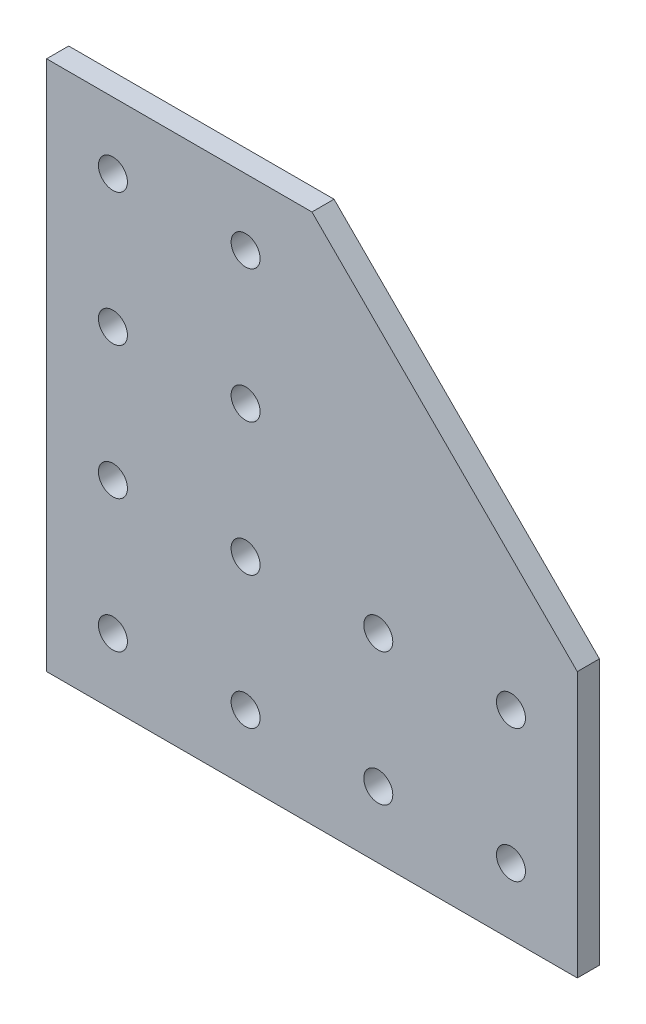
ISO-10303-21;
HEADER;
FILE_DESCRIPTION(('STEP AP214'),'2;1');
FILE_NAME('part.step','',(''),(''),'','','');
FILE_SCHEMA(('AUTOMOTIVE_DESIGN { 1 0 10303 214 1 1 1 1 }'));
ENDSEC;
DATA;
#1=APPLICATION_CONTEXT('core data for automotive mechanical design processes');
#2=APPLICATION_PROTOCOL_DEFINITION('international standard','automotive_design',2000,#1);
#3=PRODUCT_CONTEXT('',#1,'mechanical');
#4=PRODUCT('Part','Part','',(#3));
#5=PRODUCT_RELATED_PRODUCT_CATEGORY('part','',(#4));
#6=PRODUCT_DEFINITION_FORMATION('','',#4);
#7=PRODUCT_DEFINITION_CONTEXT('part definition',#1,'design');
#8=PRODUCT_DEFINITION('design','',#6,#7);
#9=PRODUCT_DEFINITION_SHAPE('','',#8);
#10=(LENGTH_UNIT() NAMED_UNIT(*) SI_UNIT(.MILLI.,.METRE.));
#11=(NAMED_UNIT(*) PLANE_ANGLE_UNIT() SI_UNIT($,.RADIAN.));
#12=(NAMED_UNIT(*) SI_UNIT($,.STERADIAN.) SOLID_ANGLE_UNIT());
#13=UNCERTAINTY_MEASURE_WITH_UNIT(LENGTH_MEASURE(1.E-05),#10,'distance_accuracy_value','');
#14=(GEOMETRIC_REPRESENTATION_CONTEXT(3) GLOBAL_UNCERTAINTY_ASSIGNED_CONTEXT((#13)) GLOBAL_UNIT_ASSIGNED_CONTEXT((#10,
#11,#12)) REPRESENTATION_CONTEXT('',''));
#15=CARTESIAN_POINT('',(0.,0.,0.));
#16=DIRECTION('',(0.,0.,1.));
#17=DIRECTION('',(1.,0.,0.));
#18=AXIS2_PLACEMENT_3D('',#15,#16,#17);
#19=CARTESIAN_POINT('',(0.,0.,3.175));
#20=DIRECTION('',(0.,0.,-1.));
#21=DIRECTION('',(-1.,0.,0.));
#22=AXIS2_PLACEMENT_3D('',#19,#20,#21);
#23=PLANE('',#22);
#24=CARTESIAN_POINT('',(57.15,133.35,3.175));
#25=DIRECTION('',(0.,0.,1.));
#26=DIRECTION('',(1.,0.,0.));
#27=AXIS2_PLACEMENT_3D('',#24,#25,#26);
#28=CIRCLE('',#27,4.1656);
#29=CARTESIAN_POINT('',(61.3156,133.35,3.175));
#30=VERTEX_POINT('',#29);
#31=EDGE_CURVE('E192',#30,#30,#28,.T.);
#32=ORIENTED_EDGE('',*,*,#31,.F.);
#33=EDGE_LOOP('',(#32));
#34=FACE_BOUND('',#33,.T.);
#35=CARTESIAN_POINT('',(57.15,57.15,3.175));
#36=DIRECTION('',(0.,0.,1.));
#37=DIRECTION('',(1.,0.,0.));
#38=AXIS2_PLACEMENT_3D('',#35,#36,#37);
#39=CIRCLE('',#38,4.1656);
#40=CARTESIAN_POINT('',(61.3156,57.15,3.175));
#41=VERTEX_POINT('',#40);
#42=EDGE_CURVE('E204',#41,#41,#39,.T.);
#43=ORIENTED_EDGE('',*,*,#42,.F.);
#44=EDGE_LOOP('',(#43));
#45=FACE_BOUND('',#44,.T.);
#46=CARTESIAN_POINT('',(133.35,57.15,3.175));
#47=DIRECTION('',(0.,0.,1.));
#48=DIRECTION('',(1.,0.,0.));
#49=AXIS2_PLACEMENT_3D('',#46,#47,#48);
#50=CIRCLE('',#49,4.1656);
#51=CARTESIAN_POINT('',(137.5156,57.15,3.175));
#52=VERTEX_POINT('',#51);
#53=EDGE_CURVE('E216',#52,#52,#50,.T.);
#54=ORIENTED_EDGE('',*,*,#53,.F.);
#55=EDGE_LOOP('',(#54));
#56=FACE_BOUND('',#55,.T.);
#57=CARTESIAN_POINT('',(19.05,95.25,3.175));
#58=DIRECTION('',(0.,0.,1.));
#59=DIRECTION('',(1.,0.,0.));
#60=AXIS2_PLACEMENT_3D('',#57,#58,#59);
#61=CIRCLE('',#60,4.1656);
#62=CARTESIAN_POINT('',(23.2156,95.25,3.175));
#63=VERTEX_POINT('',#62);
#64=EDGE_CURVE('E228',#63,#63,#61,.T.);
#65=ORIENTED_EDGE('',*,*,#64,.F.);
#66=EDGE_LOOP('',(#65));
#67=FACE_BOUND('',#66,.T.);
#68=CARTESIAN_POINT('',(57.15,19.05,3.175));
#69=DIRECTION('',(0.,0.,1.));
#70=DIRECTION('',(1.,0.,0.));
#71=AXIS2_PLACEMENT_3D('',#68,#69,#70);
#72=CIRCLE('',#71,4.1656);
#73=CARTESIAN_POINT('',(61.3156,19.05,3.175));
#74=VERTEX_POINT('',#73);
#75=EDGE_CURVE('E240',#74,#74,#72,.T.);
#76=ORIENTED_EDGE('',*,*,#75,.F.);
#77=EDGE_LOOP('',(#76));
#78=FACE_BOUND('',#77,.T.);
#79=CARTESIAN_POINT('',(133.35,19.05,3.175));
#80=DIRECTION('',(0.,0.,1.));
#81=DIRECTION('',(1.,0.,0.));
#82=AXIS2_PLACEMENT_3D('',#79,#80,#81);
#83=CIRCLE('',#82,4.1656);
#84=CARTESIAN_POINT('',(137.5156,19.05,3.175));
#85=VERTEX_POINT('',#84);
#86=EDGE_CURVE('E95',#85,#85,#83,.T.);
#87=ORIENTED_EDGE('',*,*,#86,.F.);
#88=EDGE_LOOP('',(#87));
#89=FACE_BOUND('',#88,.T.);
#90=DIRECTION('',(1.,0.,0.));
#91=VECTOR('',#90,1.);
#92=CARTESIAN_POINT('',(152.4,0.,3.175));
#93=LINE('',#92,#91);
#94=CARTESIAN_POINT('',(0.,0.,3.175));
#95=VERTEX_POINT('',#94);
#96=CARTESIAN_POINT('',(152.4,0.,3.175));
#97=VERTEX_POINT('',#96);
#98=EDGE_CURVE('E100',#95,#97,#93,.T.);
#99=ORIENTED_EDGE('',*,*,#98,.T.);
#100=DIRECTION('',(0.,1.,0.));
#101=VECTOR('',#100,1.);
#102=CARTESIAN_POINT('',(152.4,76.2,3.175));
#103=LINE('',#102,#101);
#104=CARTESIAN_POINT('',(152.4,76.2,3.175));
#105=VERTEX_POINT('',#104);
#106=EDGE_CURVE('E67',#97,#105,#103,.T.);
#107=ORIENTED_EDGE('',*,*,#106,.T.);
#108=DIRECTION('',(-0.707106781186548,0.707106781186548,0.));
#109=VECTOR('',#108,1.);
#110=CARTESIAN_POINT('',(152.4,76.2,3.175));
#111=LINE('',#110,#109);
#112=CARTESIAN_POINT('',(76.2,152.4,3.175));
#113=VERTEX_POINT('',#112);
#114=EDGE_CURVE('E71',#105,#113,#111,.T.);
#115=ORIENTED_EDGE('',*,*,#114,.T.);
#116=DIRECTION('',(-1.,0.,0.));
#117=VECTOR('',#116,1.);
#118=CARTESIAN_POINT('',(0.,152.4,3.175));
#119=LINE('',#118,#117);
#120=CARTESIAN_POINT('',(0.,152.4,3.175));
#121=VERTEX_POINT('',#120);
#122=EDGE_CURVE('E75',#113,#121,#119,.T.);
#123=ORIENTED_EDGE('',*,*,#122,.T.);
#124=DIRECTION('',(0.,-1.,0.));
#125=VECTOR('',#124,1.);
#126=CARTESIAN_POINT('',(0.,0.,3.175));
#127=LINE('',#126,#125);
#128=EDGE_CURVE('E33',#121,#95,#127,.T.);
#129=ORIENTED_EDGE('',*,*,#128,.T.);
#130=EDGE_LOOP('',(#99,#107,#115,#123,#129));
#131=FACE_BOUND('',#130,.T.);
#132=CARTESIAN_POINT('',(19.05,19.05,3.175));
#133=DIRECTION('',(0.,0.,1.));
#134=DIRECTION('',(1.,0.,0.));
#135=AXIS2_PLACEMENT_3D('',#132,#133,#134);
#136=CIRCLE('',#135,4.1656);
#137=CARTESIAN_POINT('',(23.2156,19.05,3.175));
#138=VERTEX_POINT('',#137);
#139=EDGE_CURVE('E246',#138,#138,#136,.T.);
#140=ORIENTED_EDGE('',*,*,#139,.F.);
#141=EDGE_LOOP('',(#140));
#142=FACE_BOUND('',#141,.T.);
#143=CARTESIAN_POINT('',(95.25,19.05,3.175));
#144=DIRECTION('',(0.,0.,1.));
#145=DIRECTION('',(1.,0.,0.));
#146=AXIS2_PLACEMENT_3D('',#143,#144,#145);
#147=CIRCLE('',#146,4.1656);
#148=CARTESIAN_POINT('',(99.4156,19.05,3.175));
#149=VERTEX_POINT('',#148);
#150=EDGE_CURVE('E234',#149,#149,#147,.T.);
#151=ORIENTED_EDGE('',*,*,#150,.F.);
#152=EDGE_LOOP('',(#151));
#153=FACE_BOUND('',#152,.T.);
#154=CARTESIAN_POINT('',(19.05,57.15,3.175));
#155=DIRECTION('',(0.,0.,1.));
#156=DIRECTION('',(1.,0.,0.));
#157=AXIS2_PLACEMENT_3D('',#154,#155,#156);
#158=CIRCLE('',#157,4.1656);
#159=CARTESIAN_POINT('',(23.2156,57.15,3.175));
#160=VERTEX_POINT('',#159);
#161=EDGE_CURVE('E222',#160,#160,#158,.T.);
#162=ORIENTED_EDGE('',*,*,#161,.F.);
#163=EDGE_LOOP('',(#162));
#164=FACE_BOUND('',#163,.T.);
#165=CARTESIAN_POINT('',(95.25,57.15,3.175));
#166=DIRECTION('',(0.,0.,1.));
#167=DIRECTION('',(1.,0.,0.));
#168=AXIS2_PLACEMENT_3D('',#165,#166,#167);
#169=CIRCLE('',#168,4.1656);
#170=CARTESIAN_POINT('',(99.4156,57.15,3.175));
#171=VERTEX_POINT('',#170);
#172=EDGE_CURVE('E210',#171,#171,#169,.T.);
#173=ORIENTED_EDGE('',*,*,#172,.F.);
#174=EDGE_LOOP('',(#173));
#175=FACE_BOUND('',#174,.T.);
#176=CARTESIAN_POINT('',(19.05,133.35,3.175));
#177=DIRECTION('',(0.,0.,1.));
#178=DIRECTION('',(1.,0.,0.));
#179=AXIS2_PLACEMENT_3D('',#176,#177,#178);
#180=CIRCLE('',#179,4.1656);
#181=CARTESIAN_POINT('',(23.2156,133.35,3.175));
#182=VERTEX_POINT('',#181);
#183=EDGE_CURVE('E198',#182,#182,#180,.T.);
#184=ORIENTED_EDGE('',*,*,#183,.F.);
#185=EDGE_LOOP('',(#184));
#186=FACE_BOUND('',#185,.T.);
#187=CARTESIAN_POINT('',(57.15,95.25,3.175));
#188=DIRECTION('',(0.,0.,1.));
#189=DIRECTION('',(1.,0.,0.));
#190=AXIS2_PLACEMENT_3D('',#187,#188,#189);
#191=CIRCLE('',#190,4.1656);
#192=CARTESIAN_POINT('',(61.3156,95.25,3.175));
#193=VERTEX_POINT('',#192);
#194=EDGE_CURVE('E183',#193,#193,#191,.T.);
#195=ORIENTED_EDGE('',*,*,#194,.F.);
#196=EDGE_LOOP('',(#195));
#197=FACE_BOUND('',#196,.T.);
#198=ADVANCED_FACE('F16',(#34,#45,#56,#67,#78,#89,#131,#142,#153,#164,#175,#186,#197),#23,.F.);
#199=CARTESIAN_POINT('',(0.,0.,-3.175));
#200=DIRECTION('',(0.,0.,-1.));
#201=DIRECTION('',(-1.,0.,0.));
#202=AXIS2_PLACEMENT_3D('',#199,#200,#201);
#203=PLANE('',#202);
#204=CARTESIAN_POINT('',(57.15,133.35,-3.175));
#205=DIRECTION('',(0.,0.,1.));
#206=DIRECTION('',(1.,0.,0.));
#207=AXIS2_PLACEMENT_3D('',#204,#205,#206);
#208=CIRCLE('',#207,4.1656);
#209=CARTESIAN_POINT('',(61.3156,133.35,-3.175));
#210=VERTEX_POINT('',#209);
#211=EDGE_CURVE('E189',#210,#210,#208,.T.);
#212=ORIENTED_EDGE('',*,*,#211,.T.);
#213=EDGE_LOOP('',(#212));
#214=FACE_BOUND('',#213,.T.);
#215=CARTESIAN_POINT('',(57.15,57.15,-3.175));
#216=DIRECTION('',(0.,0.,1.));
#217=DIRECTION('',(1.,0.,0.));
#218=AXIS2_PLACEMENT_3D('',#215,#216,#217);
#219=CIRCLE('',#218,4.1656);
#220=CARTESIAN_POINT('',(61.3156,57.15,-3.175));
#221=VERTEX_POINT('',#220);
#222=EDGE_CURVE('E201',#221,#221,#219,.T.);
#223=ORIENTED_EDGE('',*,*,#222,.T.);
#224=EDGE_LOOP('',(#223));
#225=FACE_BOUND('',#224,.T.);
#226=CARTESIAN_POINT('',(133.35,57.15,-3.175));
#227=DIRECTION('',(0.,0.,1.));
#228=DIRECTION('',(1.,0.,0.));
#229=AXIS2_PLACEMENT_3D('',#226,#227,#228);
#230=CIRCLE('',#229,4.1656);
#231=CARTESIAN_POINT('',(137.5156,57.15,-3.175));
#232=VERTEX_POINT('',#231);
#233=EDGE_CURVE('E213',#232,#232,#230,.T.);
#234=ORIENTED_EDGE('',*,*,#233,.T.);
#235=EDGE_LOOP('',(#234));
#236=FACE_BOUND('',#235,.T.);
#237=CARTESIAN_POINT('',(19.05,95.25,-3.175));
#238=DIRECTION('',(0.,0.,1.));
#239=DIRECTION('',(1.,0.,0.));
#240=AXIS2_PLACEMENT_3D('',#237,#238,#239);
#241=CIRCLE('',#240,4.1656);
#242=CARTESIAN_POINT('',(23.2156,95.25,-3.175));
#243=VERTEX_POINT('',#242);
#244=EDGE_CURVE('E225',#243,#243,#241,.T.);
#245=ORIENTED_EDGE('',*,*,#244,.T.);
#246=EDGE_LOOP('',(#245));
#247=FACE_BOUND('',#246,.T.);
#248=CARTESIAN_POINT('',(57.15,19.05,-3.175));
#249=DIRECTION('',(0.,0.,1.));
#250=DIRECTION('',(1.,0.,0.));
#251=AXIS2_PLACEMENT_3D('',#248,#249,#250);
#252=CIRCLE('',#251,4.1656);
#253=CARTESIAN_POINT('',(61.3156,19.05,-3.175));
#254=VERTEX_POINT('',#253);
#255=EDGE_CURVE('E237',#254,#254,#252,.T.);
#256=ORIENTED_EDGE('',*,*,#255,.T.);
#257=EDGE_LOOP('',(#256));
#258=FACE_BOUND('',#257,.T.);
#259=CARTESIAN_POINT('',(133.35,19.05,-3.175));
#260=DIRECTION('',(0.,0.,1.));
#261=DIRECTION('',(1.,0.,0.));
#262=AXIS2_PLACEMENT_3D('',#259,#260,#261);
#263=CIRCLE('',#262,4.1656);
#264=CARTESIAN_POINT('',(137.5156,19.05,-3.175));
#265=VERTEX_POINT('',#264);
#266=EDGE_CURVE('E249',#265,#265,#263,.T.);
#267=ORIENTED_EDGE('',*,*,#266,.T.);
#268=EDGE_LOOP('',(#267));
#269=FACE_BOUND('',#268,.T.);
#270=DIRECTION('',(1.,0.,0.));
#271=VECTOR('',#270,1.);
#272=CARTESIAN_POINT('',(152.4,0.,-3.175));
#273=LINE('',#272,#271);
#274=CARTESIAN_POINT('',(0.,0.,-3.175));
#275=VERTEX_POINT('',#274);
#276=CARTESIAN_POINT('',(152.4,0.,-3.175));
#277=VERTEX_POINT('',#276);
#278=EDGE_CURVE('E91',#275,#277,#273,.T.);
#279=ORIENTED_EDGE('',*,*,#278,.F.);
#280=DIRECTION('',(0.,-1.,0.));
#281=VECTOR('',#280,1.);
#282=CARTESIAN_POINT('',(0.,0.,-3.175));
#283=LINE('',#282,#281);
#284=CARTESIAN_POINT('',(0.,152.4,-3.175));
#285=VERTEX_POINT('',#284);
#286=EDGE_CURVE('E59',#285,#275,#283,.T.);
#287=ORIENTED_EDGE('',*,*,#286,.F.);
#288=DIRECTION('',(-1.,0.,0.));
#289=VECTOR('',#288,1.);
#290=CARTESIAN_POINT('',(0.,152.4,-3.175));
#291=LINE('',#290,#289);
#292=CARTESIAN_POINT('',(76.2,152.4,-3.175));
#293=VERTEX_POINT('',#292);
#294=EDGE_CURVE('E53',#293,#285,#291,.T.);
#295=ORIENTED_EDGE('',*,*,#294,.F.);
#296=DIRECTION('',(-0.707106781186548,0.707106781186548,0.));
#297=VECTOR('',#296,1.);
#298=CARTESIAN_POINT('',(152.4,76.2,-3.175));
#299=LINE('',#298,#297);
#300=CARTESIAN_POINT('',(152.4,76.2,-3.175));
#301=VERTEX_POINT('',#300);
#302=EDGE_CURVE('E82',#301,#293,#299,.T.);
#303=ORIENTED_EDGE('',*,*,#302,.F.);
#304=DIRECTION('',(0.,1.,0.));
#305=VECTOR('',#304,1.);
#306=CARTESIAN_POINT('',(152.4,76.2,-3.175));
#307=LINE('',#306,#305);
#308=EDGE_CURVE('E94',#277,#301,#307,.T.);
#309=ORIENTED_EDGE('',*,*,#308,.F.);
#310=EDGE_LOOP('',(#279,#287,#295,#303,#309));
#311=FACE_BOUND('',#310,.T.);
#312=CARTESIAN_POINT('',(19.05,19.05,-3.175));
#313=DIRECTION('',(0.,0.,1.));
#314=DIRECTION('',(1.,0.,0.));
#315=AXIS2_PLACEMENT_3D('',#312,#313,#314);
#316=CIRCLE('',#315,4.1656);
#317=CARTESIAN_POINT('',(23.2156,19.05,-3.175));
#318=VERTEX_POINT('',#317);
#319=EDGE_CURVE('E243',#318,#318,#316,.T.);
#320=ORIENTED_EDGE('',*,*,#319,.T.);
#321=EDGE_LOOP('',(#320));
#322=FACE_BOUND('',#321,.T.);
#323=CARTESIAN_POINT('',(95.25,19.05,-3.175));
#324=DIRECTION('',(0.,0.,1.));
#325=DIRECTION('',(1.,0.,0.));
#326=AXIS2_PLACEMENT_3D('',#323,#324,#325);
#327=CIRCLE('',#326,4.1656);
#328=CARTESIAN_POINT('',(99.4156,19.05,-3.175));
#329=VERTEX_POINT('',#328);
#330=EDGE_CURVE('E231',#329,#329,#327,.T.);
#331=ORIENTED_EDGE('',*,*,#330,.T.);
#332=EDGE_LOOP('',(#331));
#333=FACE_BOUND('',#332,.T.);
#334=CARTESIAN_POINT('',(19.05,57.15,-3.175));
#335=DIRECTION('',(0.,0.,1.));
#336=DIRECTION('',(1.,0.,0.));
#337=AXIS2_PLACEMENT_3D('',#334,#335,#336);
#338=CIRCLE('',#337,4.1656);
#339=CARTESIAN_POINT('',(23.2156,57.15,-3.175));
#340=VERTEX_POINT('',#339);
#341=EDGE_CURVE('E219',#340,#340,#338,.T.);
#342=ORIENTED_EDGE('',*,*,#341,.T.);
#343=EDGE_LOOP('',(#342));
#344=FACE_BOUND('',#343,.T.);
#345=CARTESIAN_POINT('',(95.25,57.15,-3.175));
#346=DIRECTION('',(0.,0.,1.));
#347=DIRECTION('',(1.,0.,0.));
#348=AXIS2_PLACEMENT_3D('',#345,#346,#347);
#349=CIRCLE('',#348,4.1656);
#350=CARTESIAN_POINT('',(99.4156,57.15,-3.175));
#351=VERTEX_POINT('',#350);
#352=EDGE_CURVE('E207',#351,#351,#349,.T.);
#353=ORIENTED_EDGE('',*,*,#352,.T.);
#354=EDGE_LOOP('',(#353));
#355=FACE_BOUND('',#354,.T.);
#356=CARTESIAN_POINT('',(19.05,133.35,-3.175));
#357=DIRECTION('',(0.,0.,1.));
#358=DIRECTION('',(1.,0.,0.));
#359=AXIS2_PLACEMENT_3D('',#356,#357,#358);
#360=CIRCLE('',#359,4.1656);
#361=CARTESIAN_POINT('',(23.2156,133.35,-3.175));
#362=VERTEX_POINT('',#361);
#363=EDGE_CURVE('E195',#362,#362,#360,.T.);
#364=ORIENTED_EDGE('',*,*,#363,.T.);
#365=EDGE_LOOP('',(#364));
#366=FACE_BOUND('',#365,.T.);
#367=CARTESIAN_POINT('',(57.15,95.25,-3.175));
#368=DIRECTION('',(0.,0.,1.));
#369=DIRECTION('',(1.,0.,0.));
#370=AXIS2_PLACEMENT_3D('',#367,#368,#369);
#371=CIRCLE('',#370,4.1656);
#372=CARTESIAN_POINT('',(61.3156,95.25,-3.175));
#373=VERTEX_POINT('',#372);
#374=EDGE_CURVE('E186',#373,#373,#371,.T.);
#375=ORIENTED_EDGE('',*,*,#374,.T.);
#376=EDGE_LOOP('',(#375));
#377=FACE_BOUND('',#376,.T.);
#378=ADVANCED_FACE('F104',(#214,#225,#236,#247,#258,#269,#311,#322,#333,#344,#355,#366,#377),
#203,.T.);
#379=CARTESIAN_POINT('',(152.4,0.,3.175));
#380=DIRECTION('',(0.,1.,0.));
#381=DIRECTION('',(-1.,0.,0.));
#382=AXIS2_PLACEMENT_3D('',#379,#380,#381);
#383=PLANE('',#382);
#384=ORIENTED_EDGE('',*,*,#278,.T.);
#385=DIRECTION('',(0.,0.,-1.));
#386=VECTOR('',#385,1.);
#387=CARTESIAN_POINT('',(152.4,0.,3.175));
#388=LINE('',#387,#386);
#389=EDGE_CURVE('E11',#97,#277,#388,.T.);
#390=ORIENTED_EDGE('',*,*,#389,.F.);
#391=ORIENTED_EDGE('',*,*,#98,.F.);
#392=DIRECTION('',(0.,0.,-1.));
#393=VECTOR('',#392,1.);
#394=CARTESIAN_POINT('',(0.,0.,3.175));
#395=LINE('',#394,#393);
#396=EDGE_CURVE('E87',#95,#275,#395,.T.);
#397=ORIENTED_EDGE('',*,*,#396,.T.);
#398=EDGE_LOOP('',(#384,#390,#391,#397));
#399=FACE_BOUND('',#398,.T.);
#400=ADVANCED_FACE('F18',(#399),#383,.F.);
#401=CARTESIAN_POINT('',(152.4,76.2,3.175));
#402=DIRECTION('',(-1.,0.,0.));
#403=DIRECTION('',(0.,0.,1.));
#404=AXIS2_PLACEMENT_3D('',#401,#402,#403);
#405=PLANE('',#404);
#406=ORIENTED_EDGE('',*,*,#308,.T.);
#407=DIRECTION('',(0.,0.,-1.));
#408=VECTOR('',#407,1.);
#409=CARTESIAN_POINT('',(152.4,76.2,3.175));
#410=LINE('',#409,#408);
#411=EDGE_CURVE('E25',#105,#301,#410,.T.);
#412=ORIENTED_EDGE('',*,*,#411,.F.);
#413=ORIENTED_EDGE('',*,*,#106,.F.);
#414=ORIENTED_EDGE('',*,*,#389,.T.);
#415=EDGE_LOOP('',(#406,#412,#413,#414));
#416=FACE_BOUND('',#415,.T.);
#417=ADVANCED_FACE('F384',(#416),#405,.F.);
#418=CARTESIAN_POINT('',(152.4,76.2,3.175));
#419=DIRECTION('',(-0.707106781186548,-0.707106781186548,0.));
#420=DIRECTION('',(0.707106781186548,-0.707106781186548,0.));
#421=AXIS2_PLACEMENT_3D('',#418,#419,#420);
#422=PLANE('',#421);
#423=ORIENTED_EDGE('',*,*,#302,.T.);
#424=DIRECTION('',(0.,0.,-1.));
#425=VECTOR('',#424,1.);
#426=CARTESIAN_POINT('',(76.2,152.4,3.175));
#427=LINE('',#426,#425);
#428=EDGE_CURVE('E79',#113,#293,#427,.T.);
#429=ORIENTED_EDGE('',*,*,#428,.F.);
#430=ORIENTED_EDGE('',*,*,#114,.F.);
#431=ORIENTED_EDGE('',*,*,#411,.T.);
#432=EDGE_LOOP('',(#423,#429,#430,#431));
#433=FACE_BOUND('',#432,.T.);
#434=ADVANCED_FACE('F80',(#433),#422,.F.);
#435=CARTESIAN_POINT('',(0.,152.4,3.175));
#436=DIRECTION('',(0.,-1.,0.));
#437=DIRECTION('',(0.,0.,-1.));
#438=AXIS2_PLACEMENT_3D('',#435,#436,#437);
#439=PLANE('',#438);
#440=ORIENTED_EDGE('',*,*,#294,.T.);
#441=DIRECTION('',(0.,0.,-1.));
#442=VECTOR('',#441,1.);
#443=CARTESIAN_POINT('',(0.,152.4,3.175));
#444=LINE('',#443,#442);
#445=EDGE_CURVE('E83',#121,#285,#444,.T.);
#446=ORIENTED_EDGE('',*,*,#445,.F.);
#447=ORIENTED_EDGE('',*,*,#122,.F.);
#448=ORIENTED_EDGE('',*,*,#428,.T.);
#449=EDGE_LOOP('',(#440,#446,#447,#448));
#450=FACE_BOUND('',#449,.T.);
#451=ADVANCED_FACE('F85',(#450),#439,.F.);
#452=CARTESIAN_POINT('',(0.,0.,3.175));
#453=DIRECTION('',(1.,0.,0.));
#454=DIRECTION('',(0.,0.,-1.));
#455=AXIS2_PLACEMENT_3D('',#452,#453,#454);
#456=PLANE('',#455);
#457=ORIENTED_EDGE('',*,*,#286,.T.);
#458=ORIENTED_EDGE('',*,*,#396,.F.);
#459=ORIENTED_EDGE('',*,*,#128,.F.);
#460=ORIENTED_EDGE('',*,*,#445,.T.);
#461=EDGE_LOOP('',(#457,#458,#459,#460));
#462=FACE_BOUND('',#461,.T.);
#463=ADVANCED_FACE('F109',(#462),#456,.F.);
#464=CARTESIAN_POINT('',(133.35,19.05,3.175));
#465=DIRECTION('',(0.,0.,-1.));
#466=DIRECTION('',(-1.,0.,0.));
#467=AXIS2_PLACEMENT_3D('',#464,#465,#466);
#468=CYLINDRICAL_SURFACE('',#467,4.1656);
#469=ORIENTED_EDGE('',*,*,#86,.T.);
#470=EDGE_LOOP('',(#469));
#471=FACE_BOUND('',#470,.T.);
#472=ORIENTED_EDGE('',*,*,#266,.F.);
#473=EDGE_LOOP('',(#472));
#474=FACE_BOUND('',#473,.T.);
#475=ADVANCED_FACE('F111',(#471,#474),#468,.F.);
#476=CARTESIAN_POINT('',(19.05,19.05,3.175));
#477=DIRECTION('',(0.,0.,-1.));
#478=DIRECTION('',(-1.,0.,0.));
#479=AXIS2_PLACEMENT_3D('',#476,#477,#478);
#480=CYLINDRICAL_SURFACE('',#479,4.1656);
#481=ORIENTED_EDGE('',*,*,#139,.T.);
#482=EDGE_LOOP('',(#481));
#483=FACE_BOUND('',#482,.T.);
#484=ORIENTED_EDGE('',*,*,#319,.F.);
#485=EDGE_LOOP('',(#484));
#486=FACE_BOUND('',#485,.T.);
#487=ADVANCED_FACE('F119',(#483,#486),#480,.F.);
#488=CARTESIAN_POINT('',(57.15,19.05,3.175));
#489=DIRECTION('',(0.,0.,-1.));
#490=DIRECTION('',(-1.,0.,0.));
#491=AXIS2_PLACEMENT_3D('',#488,#489,#490);
#492=CYLINDRICAL_SURFACE('',#491,4.1656);
#493=ORIENTED_EDGE('',*,*,#75,.T.);
#494=EDGE_LOOP('',(#493));
#495=FACE_BOUND('',#494,.T.);
#496=ORIENTED_EDGE('',*,*,#255,.F.);
#497=EDGE_LOOP('',(#496));
#498=FACE_BOUND('',#497,.T.);
#499=ADVANCED_FACE('F137',(#495,#498),#492,.F.);
#500=CARTESIAN_POINT('',(95.25,19.05,3.175));
#501=DIRECTION('',(0.,0.,-1.));
#502=DIRECTION('',(-1.,0.,0.));
#503=AXIS2_PLACEMENT_3D('',#500,#501,#502);
#504=CYLINDRICAL_SURFACE('',#503,4.1656);
#505=ORIENTED_EDGE('',*,*,#150,.T.);
#506=EDGE_LOOP('',(#505));
#507=FACE_BOUND('',#506,.T.);
#508=ORIENTED_EDGE('',*,*,#330,.F.);
#509=EDGE_LOOP('',(#508));
#510=FACE_BOUND('',#509,.T.);
#511=ADVANCED_FACE('F141',(#507,#510),#504,.F.);
#512=CARTESIAN_POINT('',(19.05,95.25,3.175));
#513=DIRECTION('',(0.,0.,-1.));
#514=DIRECTION('',(-1.,0.,0.));
#515=AXIS2_PLACEMENT_3D('',#512,#513,#514);
#516=CYLINDRICAL_SURFACE('',#515,4.1656);
#517=ORIENTED_EDGE('',*,*,#64,.T.);
#518=EDGE_LOOP('',(#517));
#519=FACE_BOUND('',#518,.T.);
#520=ORIENTED_EDGE('',*,*,#244,.F.);
#521=EDGE_LOOP('',(#520));
#522=FACE_BOUND('',#521,.T.);
#523=ADVANCED_FACE('F145',(#519,#522),#516,.F.);
#524=CARTESIAN_POINT('',(19.05,57.15,3.175));
#525=DIRECTION('',(0.,0.,-1.));
#526=DIRECTION('',(-1.,0.,0.));
#527=AXIS2_PLACEMENT_3D('',#524,#525,#526);
#528=CYLINDRICAL_SURFACE('',#527,4.1656);
#529=ORIENTED_EDGE('',*,*,#161,.T.);
#530=EDGE_LOOP('',(#529));
#531=FACE_BOUND('',#530,.T.);
#532=ORIENTED_EDGE('',*,*,#341,.F.);
#533=EDGE_LOOP('',(#532));
#534=FACE_BOUND('',#533,.T.);
#535=ADVANCED_FACE('F149',(#531,#534),#528,.F.);
#536=CARTESIAN_POINT('',(133.35,57.15,3.175));
#537=DIRECTION('',(0.,0.,-1.));
#538=DIRECTION('',(-1.,0.,0.));
#539=AXIS2_PLACEMENT_3D('',#536,#537,#538);
#540=CYLINDRICAL_SURFACE('',#539,4.1656);
#541=ORIENTED_EDGE('',*,*,#53,.T.);
#542=EDGE_LOOP('',(#541));
#543=FACE_BOUND('',#542,.T.);
#544=ORIENTED_EDGE('',*,*,#233,.F.);
#545=EDGE_LOOP('',(#544));
#546=FACE_BOUND('',#545,.T.);
#547=ADVANCED_FACE('F153',(#543,#546),#540,.F.);
#548=CARTESIAN_POINT('',(95.25,57.15,3.175));
#549=DIRECTION('',(0.,0.,-1.));
#550=DIRECTION('',(-1.,0.,0.));
#551=AXIS2_PLACEMENT_3D('',#548,#549,#550);
#552=CYLINDRICAL_SURFACE('',#551,4.1656);
#553=ORIENTED_EDGE('',*,*,#172,.T.);
#554=EDGE_LOOP('',(#553));
#555=FACE_BOUND('',#554,.T.);
#556=ORIENTED_EDGE('',*,*,#352,.F.);
#557=EDGE_LOOP('',(#556));
#558=FACE_BOUND('',#557,.T.);
#559=ADVANCED_FACE('F157',(#555,#558),#552,.F.);
#560=CARTESIAN_POINT('',(57.15,57.15,3.175));
#561=DIRECTION('',(0.,0.,-1.));
#562=DIRECTION('',(-1.,0.,0.));
#563=AXIS2_PLACEMENT_3D('',#560,#561,#562);
#564=CYLINDRICAL_SURFACE('',#563,4.1656);
#565=ORIENTED_EDGE('',*,*,#42,.T.);
#566=EDGE_LOOP('',(#565));
#567=FACE_BOUND('',#566,.T.);
#568=ORIENTED_EDGE('',*,*,#222,.F.);
#569=EDGE_LOOP('',(#568));
#570=FACE_BOUND('',#569,.T.);
#571=ADVANCED_FACE('F161',(#567,#570),#564,.F.);
#572=CARTESIAN_POINT('',(19.05,133.35,3.175));
#573=DIRECTION('',(0.,0.,-1.));
#574=DIRECTION('',(-1.,0.,0.));
#575=AXIS2_PLACEMENT_3D('',#572,#573,#574);
#576=CYLINDRICAL_SURFACE('',#575,4.1656);
#577=ORIENTED_EDGE('',*,*,#183,.T.);
#578=EDGE_LOOP('',(#577));
#579=FACE_BOUND('',#578,.T.);
#580=ORIENTED_EDGE('',*,*,#363,.F.);
#581=EDGE_LOOP('',(#580));
#582=FACE_BOUND('',#581,.T.);
#583=ADVANCED_FACE('F165',(#579,#582),#576,.F.);
#584=CARTESIAN_POINT('',(57.15,133.35,3.175));
#585=DIRECTION('',(0.,0.,-1.));
#586=DIRECTION('',(-1.,0.,0.));
#587=AXIS2_PLACEMENT_3D('',#584,#585,#586);
#588=CYLINDRICAL_SURFACE('',#587,4.1656);
#589=ORIENTED_EDGE('',*,*,#31,.T.);
#590=EDGE_LOOP('',(#589));
#591=FACE_BOUND('',#590,.T.);
#592=ORIENTED_EDGE('',*,*,#211,.F.);
#593=EDGE_LOOP('',(#592));
#594=FACE_BOUND('',#593,.T.);
#595=ADVANCED_FACE('F169',(#591,#594),#588,.F.);
#596=CARTESIAN_POINT('',(57.15,95.25,3.175));
#597=DIRECTION('',(0.,0.,-1.));
#598=DIRECTION('',(-1.,0.,0.));
#599=AXIS2_PLACEMENT_3D('',#596,#597,#598);
#600=CYLINDRICAL_SURFACE('',#599,4.1656);
#601=ORIENTED_EDGE('',*,*,#194,.T.);
#602=EDGE_LOOP('',(#601));
#603=FACE_BOUND('',#602,.T.);
#604=ORIENTED_EDGE('',*,*,#374,.F.);
#605=EDGE_LOOP('',(#604));
#606=FACE_BOUND('',#605,.T.);
#607=ADVANCED_FACE('F173',(#603,#606),#600,.F.);
#608=CLOSED_SHELL('',(#198,#378,#400,#417,#434,#451,#463,#475,#487,#499,#511,#523,#535,#547,
#559,#571,#583,#595,#607));
#609=MANIFOLD_SOLID_BREP('B1',#608);
#610=ADVANCED_BREP_SHAPE_REPRESENTATION('',(#18,#609),#14);
#611=SHAPE_DEFINITION_REPRESENTATION(#9,#610);
ENDSEC;
END-ISO-10303-21;
